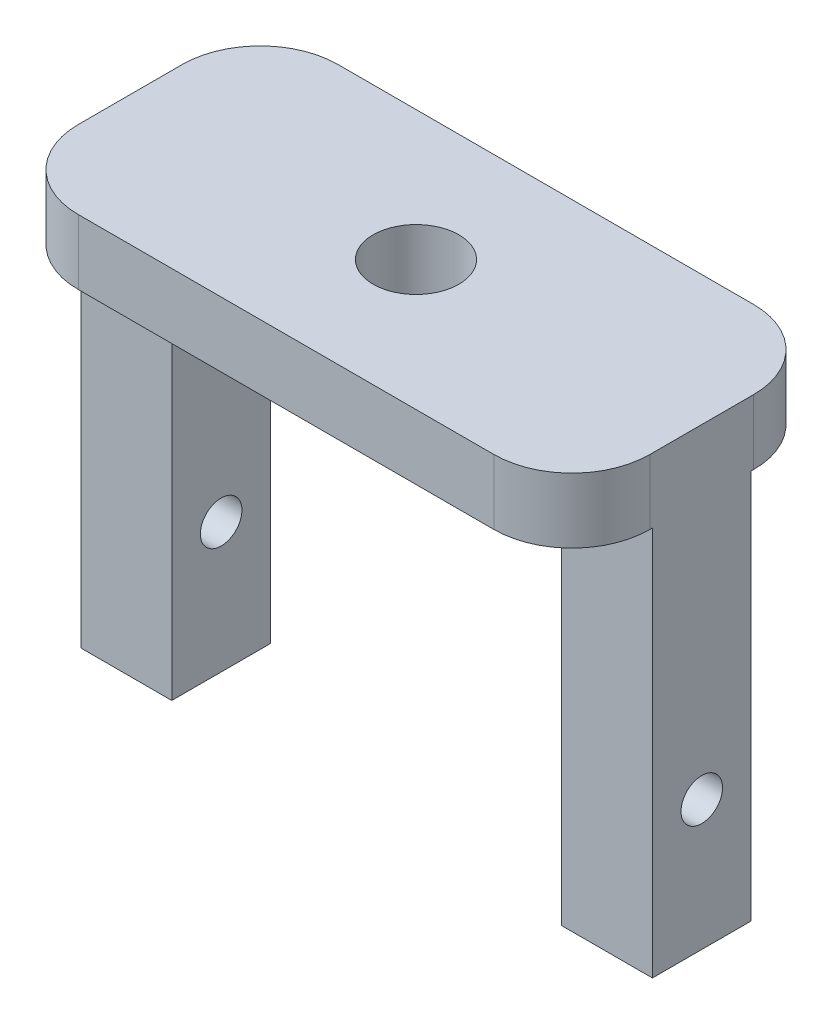
ISO-10303-21;
HEADER;
FILE_DESCRIPTION(('STEP AP214'),'2;1');
FILE_NAME('part.step','',(''),(''),'','','');
FILE_SCHEMA(('AUTOMOTIVE_DESIGN { 1 0 10303 214 1 1 1 1 }'));
ENDSEC;
DATA;
#1=APPLICATION_CONTEXT('core data for automotive mechanical design processes');
#2=APPLICATION_PROTOCOL_DEFINITION('international standard','automotive_design',2000,#1);
#3=PRODUCT_CONTEXT('',#1,'mechanical');
#4=PRODUCT('Part','Part','',(#3));
#5=PRODUCT_RELATED_PRODUCT_CATEGORY('part','',(#4));
#6=PRODUCT_DEFINITION_FORMATION('','',#4);
#7=PRODUCT_DEFINITION_CONTEXT('part definition',#1,'design');
#8=PRODUCT_DEFINITION('design','',#6,#7);
#9=PRODUCT_DEFINITION_SHAPE('','',#8);
#10=(LENGTH_UNIT() NAMED_UNIT(*) SI_UNIT(.MILLI.,.METRE.));
#11=(NAMED_UNIT(*) PLANE_ANGLE_UNIT() SI_UNIT($,.RADIAN.));
#12=(NAMED_UNIT(*) SI_UNIT($,.STERADIAN.) SOLID_ANGLE_UNIT());
#13=UNCERTAINTY_MEASURE_WITH_UNIT(LENGTH_MEASURE(1.E-05),#10,'distance_accuracy_value','');
#14=(GEOMETRIC_REPRESENTATION_CONTEXT(3) GLOBAL_UNCERTAINTY_ASSIGNED_CONTEXT((#13)) GLOBAL_UNIT_ASSIGNED_CONTEXT((#10,
#11,#12)) REPRESENTATION_CONTEXT('',''));
#15=CARTESIAN_POINT('',(0.,0.,0.));
#16=DIRECTION('',(0.,0.,1.));
#17=DIRECTION('',(1.,0.,0.));
#18=AXIS2_PLACEMENT_3D('',#15,#16,#17);
#19=CARTESIAN_POINT('',(0.,-5.,0.));
#20=DIRECTION('',(0.,-1.,0.));
#21=DIRECTION('',(0.,0.,-1.));
#22=AXIS2_PLACEMENT_3D('',#19,#20,#21);
#23=PLANE('',#22);
#24=CARTESIAN_POINT('',(0.,-5.,0.));
#25=DIRECTION('',(0.,-1.,0.));
#26=DIRECTION('',(0.,0.,-1.));
#27=AXIS2_PLACEMENT_3D('',#24,#25,#26);
#28=CIRCLE('',#27,3.3);
#29=CARTESIAN_POINT('',(0.,-5.,-3.3));
#30=VERTEX_POINT('',#29);
#31=EDGE_CURVE('E301',#30,#30,#28,.T.);
#32=ORIENTED_EDGE('',*,*,#31,.F.);
#33=EDGE_LOOP('',(#32));
#34=FACE_BOUND('',#33,.T.);
#35=DIRECTION('',(0.,0.,-1.));
#36=VECTOR('',#35,1.);
#37=CARTESIAN_POINT('',(22.,-5.,10.));
#38=LINE('',#37,#36);
#39=CARTESIAN_POINT('',(22.,-5.,4.));
#40=VERTEX_POINT('',#39);
#41=CARTESIAN_POINT('',(22.,-5.,3.8));
#42=VERTEX_POINT('',#41);
#43=EDGE_CURVE('E176',#40,#42,#38,.T.);
#44=ORIENTED_EDGE('',*,*,#43,.F.);
#45=CARTESIAN_POINT('',(16.,-5.,4.));
#46=DIRECTION('',(0.,-1.,0.));
#47=DIRECTION('',(0.,0.,-1.));
#48=AXIS2_PLACEMENT_3D('',#45,#46,#47);
#49=CIRCLE('',#48,6.);
#50=CARTESIAN_POINT('',(16.,-5.,10.));
#51=VERTEX_POINT('',#50);
#52=EDGE_CURVE('E257',#40,#51,#49,.T.);
#53=ORIENTED_EDGE('',*,*,#52,.T.);
#54=DIRECTION('',(1.,0.,0.));
#55=VECTOR('',#54,1.);
#56=CARTESIAN_POINT('',(-22.,-5.,10.));
#57=LINE('',#56,#55);
#58=CARTESIAN_POINT('',(-16.,-5.,10.));
#59=VERTEX_POINT('',#58);
#60=EDGE_CURVE('E220',#59,#51,#57,.T.);
#61=ORIENTED_EDGE('',*,*,#60,.F.);
#62=CARTESIAN_POINT('',(-16.,-5.,4.));
#63=DIRECTION('',(0.,-1.,0.));
#64=DIRECTION('',(0.,0.,-1.));
#65=AXIS2_PLACEMENT_3D('',#62,#63,#64);
#66=CIRCLE('',#65,6.);
#67=CARTESIAN_POINT('',(-22.,-5.,4.));
#68=VERTEX_POINT('',#67);
#69=EDGE_CURVE('E253',#59,#68,#66,.T.);
#70=ORIENTED_EDGE('',*,*,#69,.T.);
#71=DIRECTION('',(0.,0.,1.));
#72=VECTOR('',#71,1.);
#73=CARTESIAN_POINT('',(-22.,-5.,10.));
#74=LINE('',#73,#72);
#75=CARTESIAN_POINT('',(-22.,-5.,3.79999999999999));
#76=VERTEX_POINT('',#75);
#77=EDGE_CURVE('E217',#76,#68,#74,.T.);
#78=ORIENTED_EDGE('',*,*,#77,.F.);
#79=DIRECTION('',(-1.,0.,0.));
#80=VECTOR('',#79,1.);
#81=CARTESIAN_POINT('',(-22.,-5.,3.79999999999999));
#82=LINE('',#81,#80);
#83=CARTESIAN_POINT('',(-15.,-5.,3.79999999999999));
#84=VERTEX_POINT('',#83);
#85=EDGE_CURVE('E190',#84,#76,#82,.T.);
#86=ORIENTED_EDGE('',*,*,#85,.F.);
#87=DIRECTION('',(0.,0.,1.));
#88=VECTOR('',#87,1.);
#89=CARTESIAN_POINT('',(-15.,-5.,3.79999999999999));
#90=LINE('',#89,#88);
#91=CARTESIAN_POINT('',(-15.,-5.,-3.8));
#92=VERTEX_POINT('',#91);
#93=EDGE_CURVE('E180',#92,#84,#90,.T.);
#94=ORIENTED_EDGE('',*,*,#93,.F.);
#95=DIRECTION('',(1.,0.,0.));
#96=VECTOR('',#95,1.);
#97=CARTESIAN_POINT('',(-22.,-5.,-3.8));
#98=LINE('',#97,#96);
#99=CARTESIAN_POINT('',(-22.,-5.,-3.8));
#100=VERTEX_POINT('',#99);
#101=EDGE_CURVE('E177',#100,#92,#98,.T.);
#102=ORIENTED_EDGE('',*,*,#101,.F.);
#103=CARTESIAN_POINT('',(-22.,-5.,-4.));
#104=VERTEX_POINT('',#103);
#105=EDGE_CURVE('E218',#104,#100,#74,.T.);
#106=ORIENTED_EDGE('',*,*,#105,.F.);
#107=CARTESIAN_POINT('',(-16.,-5.,-4.));
#108=DIRECTION('',(0.,-1.,0.));
#109=DIRECTION('',(0.,0.,-1.));
#110=AXIS2_PLACEMENT_3D('',#107,#108,#109);
#111=CIRCLE('',#110,6.);
#112=CARTESIAN_POINT('',(-16.,-5.,-10.));
#113=VERTEX_POINT('',#112);
#114=EDGE_CURVE('E51',#104,#113,#111,.T.);
#115=ORIENTED_EDGE('',*,*,#114,.T.);
#116=DIRECTION('',(-1.,0.,0.));
#117=VECTOR('',#116,1.);
#118=CARTESIAN_POINT('',(-22.,-5.,-10.));
#119=LINE('',#118,#117);
#120=CARTESIAN_POINT('',(16.,-5.,-10.));
#121=VERTEX_POINT('',#120);
#122=EDGE_CURVE('E214',#121,#113,#119,.T.);
#123=ORIENTED_EDGE('',*,*,#122,.F.);
#124=CARTESIAN_POINT('',(16.,-5.,-4.));
#125=DIRECTION('',(0.,-1.,0.));
#126=DIRECTION('',(0.,0.,-1.));
#127=AXIS2_PLACEMENT_3D('',#124,#125,#126);
#128=CIRCLE('',#127,6.);
#129=CARTESIAN_POINT('',(22.,-5.,-4.));
#130=VERTEX_POINT('',#129);
#131=EDGE_CURVE('E255',#121,#130,#128,.T.);
#132=ORIENTED_EDGE('',*,*,#131,.T.);
#133=CARTESIAN_POINT('',(22.,-5.,-3.8));
#134=VERTEX_POINT('',#133);
#135=EDGE_CURVE('E215',#134,#130,#38,.T.);
#136=ORIENTED_EDGE('',*,*,#135,.F.);
#137=DIRECTION('',(1.,0.,0.));
#138=VECTOR('',#137,1.);
#139=CARTESIAN_POINT('',(22.,-5.,-3.8));
#140=LINE('',#139,#138);
#141=CARTESIAN_POINT('',(15.,-5.,-3.8));
#142=VERTEX_POINT('',#141);
#143=EDGE_CURVE('E171',#142,#134,#140,.T.);
#144=ORIENTED_EDGE('',*,*,#143,.F.);
#145=DIRECTION('',(0.,0.,-1.));
#146=VECTOR('',#145,1.);
#147=CARTESIAN_POINT('',(15.,-5.,3.8));
#148=LINE('',#147,#146);
#149=CARTESIAN_POINT('',(15.,-5.,3.8));
#150=VERTEX_POINT('',#149);
#151=EDGE_CURVE('E286',#150,#142,#148,.T.);
#152=ORIENTED_EDGE('',*,*,#151,.F.);
#153=DIRECTION('',(-1.,0.,0.));
#154=VECTOR('',#153,1.);
#155=CARTESIAN_POINT('',(22.,-5.,3.8));
#156=LINE('',#155,#154);
#157=EDGE_CURVE('E289',#42,#150,#156,.T.);
#158=ORIENTED_EDGE('',*,*,#157,.F.);
#159=EDGE_LOOP('',(#44,#53,#61,#70,#78,#86,#94,#102,#106,#115,#123,#132,#136,#144,#152,#158));
#160=FACE_BOUND('',#159,.T.);
#161=ADVANCED_FACE('F35',(#34,#160),#23,.T.);
#162=CARTESIAN_POINT('',(22.,-5.,10.));
#163=DIRECTION('',(1.,0.,0.));
#164=DIRECTION('',(0.,0.,-1.));
#165=AXIS2_PLACEMENT_3D('',#162,#163,#164);
#166=PLANE('',#165);
#167=CARTESIAN_POINT('',(22.,-25.,0.));
#168=DIRECTION('',(1.,0.,0.));
#169=DIRECTION('',(0.,0.,-1.));
#170=AXIS2_PLACEMENT_3D('',#167,#168,#169);
#171=CIRCLE('',#170,1.6);
#172=CARTESIAN_POINT('',(22.,-25.,-1.6));
#173=VERTEX_POINT('',#172);
#174=EDGE_CURVE('E311',#173,#173,#171,.T.);
#175=ORIENTED_EDGE('',*,*,#174,.F.);
#176=EDGE_LOOP('',(#175));
#177=FACE_BOUND('',#176,.T.);
#178=DIRECTION('',(0.,0.,-1.));
#179=VECTOR('',#178,1.);
#180=CARTESIAN_POINT('',(22.,0.,10.));
#181=LINE('',#180,#179);
#182=CARTESIAN_POINT('',(22.,0.,4.));
#183=VERTEX_POINT('',#182);
#184=CARTESIAN_POINT('',(22.,0.,-4.));
#185=VERTEX_POINT('',#184);
#186=EDGE_CURVE('E212',#183,#185,#181,.T.);
#187=ORIENTED_EDGE('',*,*,#186,.F.);
#188=DIRECTION('',(0.,1.,0.));
#189=VECTOR('',#188,1.);
#190=CARTESIAN_POINT('',(22.,-5.,4.));
#191=LINE('',#190,#189);
#192=EDGE_CURVE('E250',#183,#40,#191,.F.);
#193=ORIENTED_EDGE('',*,*,#192,.T.);
#194=ORIENTED_EDGE('',*,*,#43,.T.);
#195=DIRECTION('',(0.,1.,0.));
#196=VECTOR('',#195,1.);
#197=CARTESIAN_POINT('',(22.,-35.,3.8));
#198=LINE('',#197,#196);
#199=CARTESIAN_POINT('',(22.,-35.,3.8));
#200=VERTEX_POINT('',#199);
#201=EDGE_CURVE('E155',#200,#42,#198,.T.);
#202=ORIENTED_EDGE('',*,*,#201,.F.);
#203=DIRECTION('',(0.,0.,1.));
#204=VECTOR('',#203,1.);
#205=CARTESIAN_POINT('',(22.,-35.,3.8));
#206=LINE('',#205,#204);
#207=CARTESIAN_POINT('',(22.,-35.,-3.8));
#208=VERTEX_POINT('',#207);
#209=EDGE_CURVE('E162',#208,#200,#206,.T.);
#210=ORIENTED_EDGE('',*,*,#209,.F.);
#211=DIRECTION('',(0.,1.,0.));
#212=VECTOR('',#211,1.);
#213=CARTESIAN_POINT('',(22.,-35.,-3.8));
#214=LINE('',#213,#212);
#215=EDGE_CURVE('E282',#208,#134,#214,.T.);
#216=ORIENTED_EDGE('',*,*,#215,.T.);
#217=ORIENTED_EDGE('',*,*,#135,.T.);
#218=DIRECTION('',(0.,1.,0.));
#219=VECTOR('',#218,1.);
#220=CARTESIAN_POINT('',(22.,-5.,-4.));
#221=LINE('',#220,#219);
#222=EDGE_CURVE('E247',#130,#185,#221,.T.);
#223=ORIENTED_EDGE('',*,*,#222,.T.);
#224=EDGE_LOOP('',(#187,#193,#194,#202,#210,#216,#217,#223));
#225=FACE_BOUND('',#224,.T.);
#226=ADVANCED_FACE('F174',(#177,#225),#166,.T.);
#227=CARTESIAN_POINT('',(-22.,-5.,10.));
#228=DIRECTION('',(0.,0.,1.));
#229=DIRECTION('',(1.,0.,0.));
#230=AXIS2_PLACEMENT_3D('',#227,#228,#229);
#231=PLANE('',#230);
#232=ORIENTED_EDGE('',*,*,#60,.T.);
#233=DIRECTION('',(0.,1.,0.));
#234=VECTOR('',#233,1.);
#235=CARTESIAN_POINT('',(16.,-5.,10.));
#236=LINE('',#235,#234);
#237=CARTESIAN_POINT('',(16.,0.,10.));
#238=VERTEX_POINT('',#237);
#239=EDGE_CURVE('E236',#51,#238,#236,.T.);
#240=ORIENTED_EDGE('',*,*,#239,.T.);
#241=DIRECTION('',(1.,0.,0.));
#242=VECTOR('',#241,1.);
#243=CARTESIAN_POINT('',(-22.,0.,10.));
#244=LINE('',#243,#242);
#245=CARTESIAN_POINT('',(-16.,0.,10.));
#246=VERTEX_POINT('',#245);
#247=EDGE_CURVE('E232',#246,#238,#244,.T.);
#248=ORIENTED_EDGE('',*,*,#247,.F.);
#249=DIRECTION('',(0.,1.,0.));
#250=VECTOR('',#249,1.);
#251=CARTESIAN_POINT('',(-16.,-5.,10.));
#252=LINE('',#251,#250);
#253=EDGE_CURVE('E223',#246,#59,#252,.F.);
#254=ORIENTED_EDGE('',*,*,#253,.T.);
#255=EDGE_LOOP('',(#232,#240,#248,#254));
#256=FACE_BOUND('',#255,.T.);
#257=ADVANCED_FACE('F340',(#256),#231,.T.);
#258=CARTESIAN_POINT('',(-22.,-5.,10.));
#259=DIRECTION('',(-1.,0.,0.));
#260=DIRECTION('',(0.,0.,1.));
#261=AXIS2_PLACEMENT_3D('',#258,#259,#260);
#262=PLANE('',#261);
#263=CARTESIAN_POINT('',(-22.,-25.,0.));
#264=DIRECTION('',(1.,0.,0.));
#265=DIRECTION('',(0.,0.,-1.));
#266=AXIS2_PLACEMENT_3D('',#263,#264,#265);
#267=CIRCLE('',#266,1.6);
#268=CARTESIAN_POINT('',(-22.,-25.,-1.6));
#269=VERTEX_POINT('',#268);
#270=EDGE_CURVE('E314',#269,#269,#267,.T.);
#271=ORIENTED_EDGE('',*,*,#270,.T.);
#272=EDGE_LOOP('',(#271));
#273=FACE_BOUND('',#272,.T.);
#274=ORIENTED_EDGE('',*,*,#77,.T.);
#275=DIRECTION('',(0.,1.,0.));
#276=VECTOR('',#275,1.);
#277=CARTESIAN_POINT('',(-22.,-5.,4.));
#278=LINE('',#277,#276);
#279=CARTESIAN_POINT('',(-22.,0.,4.));
#280=VERTEX_POINT('',#279);
#281=EDGE_CURVE('E11',#68,#280,#278,.T.);
#282=ORIENTED_EDGE('',*,*,#281,.T.);
#283=DIRECTION('',(0.,0.,1.));
#284=VECTOR('',#283,1.);
#285=CARTESIAN_POINT('',(-22.,0.,10.));
#286=LINE('',#285,#284);
#287=CARTESIAN_POINT('',(-22.,0.,-4.));
#288=VERTEX_POINT('',#287);
#289=EDGE_CURVE('E229',#288,#280,#286,.T.);
#290=ORIENTED_EDGE('',*,*,#289,.F.);
#291=DIRECTION('',(0.,1.,0.));
#292=VECTOR('',#291,1.);
#293=CARTESIAN_POINT('',(-22.,-5.,-4.));
#294=LINE('',#293,#292);
#295=EDGE_CURVE('E44',#288,#104,#294,.F.);
#296=ORIENTED_EDGE('',*,*,#295,.T.);
#297=ORIENTED_EDGE('',*,*,#105,.T.);
#298=DIRECTION('',(0.,1.,0.));
#299=VECTOR('',#298,1.);
#300=CARTESIAN_POINT('',(-22.,-35.,-3.8));
#301=LINE('',#300,#299);
#302=CARTESIAN_POINT('',(-22.,-35.,-3.8));
#303=VERTEX_POINT('',#302);
#304=EDGE_CURVE('E209',#303,#100,#301,.T.);
#305=ORIENTED_EDGE('',*,*,#304,.F.);
#306=DIRECTION('',(0.,0.,-1.));
#307=VECTOR('',#306,1.);
#308=CARTESIAN_POINT('',(-22.,-35.,3.79999999999999));
#309=LINE('',#308,#307);
#310=CARTESIAN_POINT('',(-22.,-35.,3.79999999999999));
#311=VERTEX_POINT('',#310);
#312=EDGE_CURVE('E186',#311,#303,#309,.T.);
#313=ORIENTED_EDGE('',*,*,#312,.F.);
#314=DIRECTION('',(0.,1.,0.));
#315=VECTOR('',#314,1.);
#316=CARTESIAN_POINT('',(-22.,-35.,3.79999999999999));
#317=LINE('',#316,#315);
#318=EDGE_CURVE('E195',#311,#76,#317,.T.);
#319=ORIENTED_EDGE('',*,*,#318,.T.);
#320=EDGE_LOOP('',(#274,#282,#290,#296,#297,#305,#313,#319));
#321=FACE_BOUND('',#320,.T.);
#322=ADVANCED_FACE('F267',(#273,#321),#262,.T.);
#323=CARTESIAN_POINT('',(-22.,-5.,-10.));
#324=DIRECTION('',(0.,0.,-1.));
#325=DIRECTION('',(-1.,0.,0.));
#326=AXIS2_PLACEMENT_3D('',#323,#324,#325);
#327=PLANE('',#326);
#328=DIRECTION('',(-1.,0.,0.));
#329=VECTOR('',#328,1.);
#330=CARTESIAN_POINT('',(-22.,0.,-10.));
#331=LINE('',#330,#329);
#332=CARTESIAN_POINT('',(16.,0.,-10.));
#333=VERTEX_POINT('',#332);
#334=CARTESIAN_POINT('',(-16.,0.,-10.));
#335=VERTEX_POINT('',#334);
#336=EDGE_CURVE('E226',#333,#335,#331,.T.);
#337=ORIENTED_EDGE('',*,*,#336,.F.);
#338=DIRECTION('',(0.,1.,0.));
#339=VECTOR('',#338,1.);
#340=CARTESIAN_POINT('',(16.,-5.,-10.));
#341=LINE('',#340,#339);
#342=EDGE_CURVE('E58',#333,#121,#341,.F.);
#343=ORIENTED_EDGE('',*,*,#342,.T.);
#344=ORIENTED_EDGE('',*,*,#122,.T.);
#345=DIRECTION('',(0.,1.,0.));
#346=VECTOR('',#345,1.);
#347=CARTESIAN_POINT('',(-16.,-5.,-10.));
#348=LINE('',#347,#346);
#349=EDGE_CURVE('E259',#113,#335,#348,.T.);
#350=ORIENTED_EDGE('',*,*,#349,.T.);
#351=EDGE_LOOP('',(#337,#343,#344,#350));
#352=FACE_BOUND('',#351,.T.);
#353=ADVANCED_FACE('F272',(#352),#327,.T.);
#354=CARTESIAN_POINT('',(0.,0.,0.));
#355=DIRECTION('',(0.,-1.,0.));
#356=DIRECTION('',(0.,0.,-1.));
#357=AXIS2_PLACEMENT_3D('',#354,#355,#356);
#358=PLANE('',#357);
#359=CARTESIAN_POINT('',(0.,0.,0.));
#360=DIRECTION('',(0.,-1.,0.));
#361=DIRECTION('',(0.,0.,-1.));
#362=AXIS2_PLACEMENT_3D('',#359,#360,#361);
#363=CIRCLE('',#362,3.3);
#364=CARTESIAN_POINT('',(0.,0.,-3.3));
#365=VERTEX_POINT('',#364);
#366=EDGE_CURVE('E299',#365,#365,#363,.T.);
#367=ORIENTED_EDGE('',*,*,#366,.T.);
#368=EDGE_LOOP('',(#367));
#369=FACE_BOUND('',#368,.T.);
#370=ORIENTED_EDGE('',*,*,#247,.T.);
#371=CARTESIAN_POINT('',(16.,0.,4.));
#372=DIRECTION('',(0.,-1.,0.));
#373=DIRECTION('',(0.,0.,-1.));
#374=AXIS2_PLACEMENT_3D('',#371,#372,#373);
#375=CIRCLE('',#374,6.);
#376=EDGE_CURVE('E245',#238,#183,#375,.F.);
#377=ORIENTED_EDGE('',*,*,#376,.T.);
#378=ORIENTED_EDGE('',*,*,#186,.T.);
#379=CARTESIAN_POINT('',(16.,0.,-4.));
#380=DIRECTION('',(0.,-1.,0.));
#381=DIRECTION('',(0.,0.,-1.));
#382=AXIS2_PLACEMENT_3D('',#379,#380,#381);
#383=CIRCLE('',#382,6.);
#384=EDGE_CURVE('E243',#185,#333,#383,.F.);
#385=ORIENTED_EDGE('',*,*,#384,.T.);
#386=ORIENTED_EDGE('',*,*,#336,.T.);
#387=CARTESIAN_POINT('',(-16.,0.,-4.));
#388=DIRECTION('',(0.,-1.,0.));
#389=DIRECTION('',(0.,0.,-1.));
#390=AXIS2_PLACEMENT_3D('',#387,#388,#389);
#391=CIRCLE('',#390,6.);
#392=EDGE_CURVE('E239',#335,#288,#391,.F.);
#393=ORIENTED_EDGE('',*,*,#392,.T.);
#394=ORIENTED_EDGE('',*,*,#289,.T.);
#395=CARTESIAN_POINT('',(-16.,0.,4.));
#396=DIRECTION('',(0.,-1.,0.));
#397=DIRECTION('',(0.,0.,-1.));
#398=AXIS2_PLACEMENT_3D('',#395,#396,#397);
#399=CIRCLE('',#398,6.);
#400=EDGE_CURVE('E241',#280,#246,#399,.F.);
#401=ORIENTED_EDGE('',*,*,#400,.T.);
#402=EDGE_LOOP('',(#370,#377,#378,#385,#386,#393,#394,#401));
#403=FACE_BOUND('',#402,.T.);
#404=ADVANCED_FACE('F274',(#369,#403),#358,.F.);
#405=CARTESIAN_POINT('',(-22.,-35.,-3.8));
#406=DIRECTION('',(0.,0.,1.));
#407=DIRECTION('',(1.,0.,0.));
#408=AXIS2_PLACEMENT_3D('',#405,#406,#407);
#409=PLANE('',#408);
#410=ORIENTED_EDGE('',*,*,#101,.T.);
#411=DIRECTION('',(0.,1.,0.));
#412=VECTOR('',#411,1.);
#413=CARTESIAN_POINT('',(-15.,-35.,-3.8));
#414=LINE('',#413,#412);
#415=CARTESIAN_POINT('',(-15.,-35.,-3.8));
#416=VERTEX_POINT('',#415);
#417=EDGE_CURVE('E206',#416,#92,#414,.T.);
#418=ORIENTED_EDGE('',*,*,#417,.F.);
#419=DIRECTION('',(1.,0.,0.));
#420=VECTOR('',#419,1.);
#421=CARTESIAN_POINT('',(-22.,-35.,-3.8));
#422=LINE('',#421,#420);
#423=EDGE_CURVE('E189',#303,#416,#422,.T.);
#424=ORIENTED_EDGE('',*,*,#423,.F.);
#425=ORIENTED_EDGE('',*,*,#304,.T.);
#426=EDGE_LOOP('',(#410,#418,#424,#425));
#427=FACE_BOUND('',#426,.T.);
#428=ADVANCED_FACE('F346',(#427),#409,.F.);
#429=CARTESIAN_POINT('',(-15.,-35.,3.79999999999999));
#430=DIRECTION('',(-1.,0.,0.));
#431=DIRECTION('',(0.,0.,1.));
#432=AXIS2_PLACEMENT_3D('',#429,#430,#431);
#433=PLANE('',#432);
#434=CARTESIAN_POINT('',(-15.,-25.,0.));
#435=DIRECTION('',(-1.,0.,0.));
#436=DIRECTION('',(0.,0.,1.));
#437=AXIS2_PLACEMENT_3D('',#434,#435,#436);
#438=CIRCLE('',#437,1.6);
#439=CARTESIAN_POINT('',(-15.,-25.,1.6));
#440=VERTEX_POINT('',#439);
#441=EDGE_CURVE('E306',#440,#440,#438,.T.);
#442=ORIENTED_EDGE('',*,*,#441,.T.);
#443=EDGE_LOOP('',(#442));
#444=FACE_BOUND('',#443,.T.);
#445=ORIENTED_EDGE('',*,*,#93,.T.);
#446=DIRECTION('',(0.,1.,0.));
#447=VECTOR('',#446,1.);
#448=CARTESIAN_POINT('',(-15.,-35.,3.79999999999999));
#449=LINE('',#448,#447);
#450=CARTESIAN_POINT('',(-15.,-35.,3.79999999999999));
#451=VERTEX_POINT('',#450);
#452=EDGE_CURVE('E203',#451,#84,#449,.T.);
#453=ORIENTED_EDGE('',*,*,#452,.F.);
#454=DIRECTION('',(0.,0.,1.));
#455=VECTOR('',#454,1.);
#456=CARTESIAN_POINT('',(-15.,-35.,3.79999999999999));
#457=LINE('',#456,#455);
#458=EDGE_CURVE('E192',#416,#451,#457,.T.);
#459=ORIENTED_EDGE('',*,*,#458,.F.);
#460=ORIENTED_EDGE('',*,*,#417,.T.);
#461=EDGE_LOOP('',(#445,#453,#459,#460));
#462=FACE_BOUND('',#461,.T.);
#463=ADVANCED_FACE('F378',(#444,#462),#433,.F.);
#464=CARTESIAN_POINT('',(-22.,-35.,3.79999999999999));
#465=DIRECTION('',(0.,0.,-1.));
#466=DIRECTION('',(-1.,0.,0.));
#467=AXIS2_PLACEMENT_3D('',#464,#465,#466);
#468=PLANE('',#467);
#469=ORIENTED_EDGE('',*,*,#85,.T.);
#470=ORIENTED_EDGE('',*,*,#318,.F.);
#471=DIRECTION('',(-1.,0.,0.));
#472=VECTOR('',#471,1.);
#473=CARTESIAN_POINT('',(-22.,-35.,3.79999999999999));
#474=LINE('',#473,#472);
#475=EDGE_CURVE('E194',#451,#311,#474,.T.);
#476=ORIENTED_EDGE('',*,*,#475,.F.);
#477=ORIENTED_EDGE('',*,*,#452,.T.);
#478=EDGE_LOOP('',(#469,#470,#476,#477));
#479=FACE_BOUND('',#478,.T.);
#480=ADVANCED_FACE('F375',(#479),#468,.F.);
#481=CARTESIAN_POINT('',(0.,-35.,0.));
#482=DIRECTION('',(0.,-1.,0.));
#483=DIRECTION('',(0.,0.,-1.));
#484=AXIS2_PLACEMENT_3D('',#481,#482,#483);
#485=PLANE('',#484);
#486=ORIENTED_EDGE('',*,*,#312,.T.);
#487=ORIENTED_EDGE('',*,*,#423,.T.);
#488=ORIENTED_EDGE('',*,*,#458,.T.);
#489=ORIENTED_EDGE('',*,*,#475,.T.);
#490=EDGE_LOOP('',(#486,#487,#488,#489));
#491=FACE_BOUND('',#490,.T.);
#492=ADVANCED_FACE('F383',(#491),#485,.T.);
#493=CARTESIAN_POINT('',(22.,-35.,3.8));
#494=DIRECTION('',(0.,0.,-1.));
#495=DIRECTION('',(-1.,0.,0.));
#496=AXIS2_PLACEMENT_3D('',#493,#494,#495);
#497=PLANE('',#496);
#498=ORIENTED_EDGE('',*,*,#157,.T.);
#499=DIRECTION('',(0.,1.,0.));
#500=VECTOR('',#499,1.);
#501=CARTESIAN_POINT('',(15.,-35.,3.8));
#502=LINE('',#501,#500);
#503=CARTESIAN_POINT('',(15.,-35.,3.8));
#504=VERTEX_POINT('',#503);
#505=EDGE_CURVE('E158',#504,#150,#502,.T.);
#506=ORIENTED_EDGE('',*,*,#505,.F.);
#507=DIRECTION('',(-1.,0.,0.));
#508=VECTOR('',#507,1.);
#509=CARTESIAN_POINT('',(22.,-35.,3.8));
#510=LINE('',#509,#508);
#511=EDGE_CURVE('E151',#200,#504,#510,.T.);
#512=ORIENTED_EDGE('',*,*,#511,.F.);
#513=ORIENTED_EDGE('',*,*,#201,.T.);
#514=EDGE_LOOP('',(#498,#506,#512,#513));
#515=FACE_BOUND('',#514,.T.);
#516=ADVANCED_FACE('F153',(#515),#497,.F.);
#517=CARTESIAN_POINT('',(15.,-35.,3.8));
#518=DIRECTION('',(1.,0.,0.));
#519=DIRECTION('',(0.,0.,-1.));
#520=AXIS2_PLACEMENT_3D('',#517,#518,#519);
#521=PLANE('',#520);
#522=CARTESIAN_POINT('',(15.,-25.,0.));
#523=DIRECTION('',(1.,0.,0.));
#524=DIRECTION('',(0.,0.,-1.));
#525=AXIS2_PLACEMENT_3D('',#522,#523,#524);
#526=CIRCLE('',#525,1.6);
#527=CARTESIAN_POINT('',(15.,-25.,-1.6));
#528=VERTEX_POINT('',#527);
#529=EDGE_CURVE('E39',#528,#528,#526,.T.);
#530=ORIENTED_EDGE('',*,*,#529,.T.);
#531=EDGE_LOOP('',(#530));
#532=FACE_BOUND('',#531,.T.);
#533=ORIENTED_EDGE('',*,*,#151,.T.);
#534=DIRECTION('',(0.,1.,0.));
#535=VECTOR('',#534,1.);
#536=CARTESIAN_POINT('',(15.,-35.,-3.8));
#537=LINE('',#536,#535);
#538=CARTESIAN_POINT('',(15.,-35.,-3.8));
#539=VERTEX_POINT('',#538);
#540=EDGE_CURVE('E182',#539,#142,#537,.T.);
#541=ORIENTED_EDGE('',*,*,#540,.F.);
#542=DIRECTION('',(0.,0.,-1.));
#543=VECTOR('',#542,1.);
#544=CARTESIAN_POINT('',(15.,-35.,3.8));
#545=LINE('',#544,#543);
#546=EDGE_CURVE('E161',#504,#539,#545,.T.);
#547=ORIENTED_EDGE('',*,*,#546,.F.);
#548=ORIENTED_EDGE('',*,*,#505,.T.);
#549=EDGE_LOOP('',(#533,#541,#547,#548));
#550=FACE_BOUND('',#549,.T.);
#551=ADVANCED_FACE('F296',(#532,#550),#521,.F.);
#552=CARTESIAN_POINT('',(22.,-35.,-3.8));
#553=DIRECTION('',(0.,0.,1.));
#554=DIRECTION('',(1.,0.,0.));
#555=AXIS2_PLACEMENT_3D('',#552,#553,#554);
#556=PLANE('',#555);
#557=ORIENTED_EDGE('',*,*,#143,.T.);
#558=ORIENTED_EDGE('',*,*,#215,.F.);
#559=DIRECTION('',(1.,0.,0.));
#560=VECTOR('',#559,1.);
#561=CARTESIAN_POINT('',(22.,-35.,-3.8));
#562=LINE('',#561,#560);
#563=EDGE_CURVE('E167',#539,#208,#562,.T.);
#564=ORIENTED_EDGE('',*,*,#563,.F.);
#565=ORIENTED_EDGE('',*,*,#540,.T.);
#566=EDGE_LOOP('',(#557,#558,#564,#565));
#567=FACE_BOUND('',#566,.T.);
#568=ADVANCED_FACE('F294',(#567),#556,.F.);
#569=CARTESIAN_POINT('',(0.,-35.,0.));
#570=DIRECTION('',(0.,1.,0.));
#571=DIRECTION('',(0.,0.,1.));
#572=AXIS2_PLACEMENT_3D('',#569,#570,#571);
#573=PLANE('',#572);
#574=ORIENTED_EDGE('',*,*,#209,.T.);
#575=ORIENTED_EDGE('',*,*,#511,.T.);
#576=ORIENTED_EDGE('',*,*,#546,.T.);
#577=ORIENTED_EDGE('',*,*,#563,.T.);
#578=EDGE_LOOP('',(#574,#575,#576,#577));
#579=FACE_BOUND('',#578,.T.);
#580=ADVANCED_FACE('F165',(#579),#573,.F.);
#581=CARTESIAN_POINT('',(0.,0.,0.));
#582=DIRECTION('',(0.,-1.,0.));
#583=DIRECTION('',(0.,0.,-1.));
#584=AXIS2_PLACEMENT_3D('',#581,#582,#583);
#585=CYLINDRICAL_SURFACE('',#584,3.3);
#586=ORIENTED_EDGE('',*,*,#366,.F.);
#587=EDGE_LOOP('',(#586));
#588=FACE_BOUND('',#587,.T.);
#589=ORIENTED_EDGE('',*,*,#31,.T.);
#590=EDGE_LOOP('',(#589));
#591=FACE_BOUND('',#590,.T.);
#592=ADVANCED_FACE('F360',(#588,#591),#585,.F.);
#593=CARTESIAN_POINT('',(16.,-5.,4.));
#594=DIRECTION('',(0.,1.,0.));
#595=DIRECTION('',(0.,0.,1.));
#596=AXIS2_PLACEMENT_3D('',#593,#594,#595);
#597=CYLINDRICAL_SURFACE('',#596,6.);
#598=ORIENTED_EDGE('',*,*,#52,.F.);
#599=ORIENTED_EDGE('',*,*,#192,.F.);
#600=ORIENTED_EDGE('',*,*,#376,.F.);
#601=ORIENTED_EDGE('',*,*,#239,.F.);
#602=EDGE_LOOP('',(#598,#599,#600,#601));
#603=FACE_BOUND('',#602,.T.);
#604=ADVANCED_FACE('F357',(#603),#597,.T.);
#605=CARTESIAN_POINT('',(16.,-5.,-4.));
#606=DIRECTION('',(0.,1.,0.));
#607=DIRECTION('',(0.,0.,1.));
#608=AXIS2_PLACEMENT_3D('',#605,#606,#607);
#609=CYLINDRICAL_SURFACE('',#608,6.);
#610=ORIENTED_EDGE('',*,*,#131,.F.);
#611=ORIENTED_EDGE('',*,*,#342,.F.);
#612=ORIENTED_EDGE('',*,*,#384,.F.);
#613=ORIENTED_EDGE('',*,*,#222,.F.);
#614=EDGE_LOOP('',(#610,#611,#612,#613));
#615=FACE_BOUND('',#614,.T.);
#616=ADVANCED_FACE('F278',(#615),#609,.T.);
#617=CARTESIAN_POINT('',(-16.,-5.,4.));
#618=DIRECTION('',(0.,1.,0.));
#619=DIRECTION('',(0.,0.,1.));
#620=AXIS2_PLACEMENT_3D('',#617,#618,#619);
#621=CYLINDRICAL_SURFACE('',#620,6.);
#622=ORIENTED_EDGE('',*,*,#69,.F.);
#623=ORIENTED_EDGE('',*,*,#253,.F.);
#624=ORIENTED_EDGE('',*,*,#400,.F.);
#625=ORIENTED_EDGE('',*,*,#281,.F.);
#626=EDGE_LOOP('',(#622,#623,#624,#625));
#627=FACE_BOUND('',#626,.T.);
#628=ADVANCED_FACE('F332',(#627),#621,.T.);
#629=CARTESIAN_POINT('',(-16.,-5.,-4.));
#630=DIRECTION('',(0.,1.,0.));
#631=DIRECTION('',(0.,0.,1.));
#632=AXIS2_PLACEMENT_3D('',#629,#630,#631);
#633=CYLINDRICAL_SURFACE('',#632,6.);
#634=ORIENTED_EDGE('',*,*,#114,.F.);
#635=ORIENTED_EDGE('',*,*,#295,.F.);
#636=ORIENTED_EDGE('',*,*,#392,.F.);
#637=ORIENTED_EDGE('',*,*,#349,.F.);
#638=EDGE_LOOP('',(#634,#635,#636,#637));
#639=FACE_BOUND('',#638,.T.);
#640=ADVANCED_FACE('F37',(#639),#633,.T.);
#641=CARTESIAN_POINT('',(-22.,-25.,0.));
#642=DIRECTION('',(1.,0.,0.));
#643=DIRECTION('',(0.,0.,-1.));
#644=AXIS2_PLACEMENT_3D('',#641,#642,#643);
#645=CYLINDRICAL_SURFACE('',#644,1.6);
#646=ORIENTED_EDGE('',*,*,#174,.T.);
#647=EDGE_LOOP('',(#646));
#648=FACE_BOUND('',#647,.T.);
#649=ORIENTED_EDGE('',*,*,#529,.F.);
#650=EDGE_LOOP('',(#649));
#651=FACE_BOUND('',#650,.T.);
#652=ADVANCED_FACE('F322',(#648,#651),#645,.F.);
#653=ORIENTED_EDGE('',*,*,#270,.F.);
#654=EDGE_LOOP('',(#653));
#655=FACE_BOUND('',#654,.T.);
#656=ORIENTED_EDGE('',*,*,#441,.F.);
#657=EDGE_LOOP('',(#656));
#658=FACE_BOUND('',#657,.T.);
#659=ADVANCED_FACE('F324',(#655,#658),#645,.F.);
#660=CLOSED_SHELL('',(#161,#226,#257,#322,#353,#404,#428,#463,#480,#492,#516,#551,#568,#580,
#592,#604,#616,#628,#640,#652,#659));
#661=MANIFOLD_SOLID_BREP('B2',#660);
#662=ADVANCED_BREP_SHAPE_REPRESENTATION('',(#18,#661),#14);
#663=SHAPE_DEFINITION_REPRESENTATION(#9,#662);
ENDSEC;
END-ISO-10303-21;
